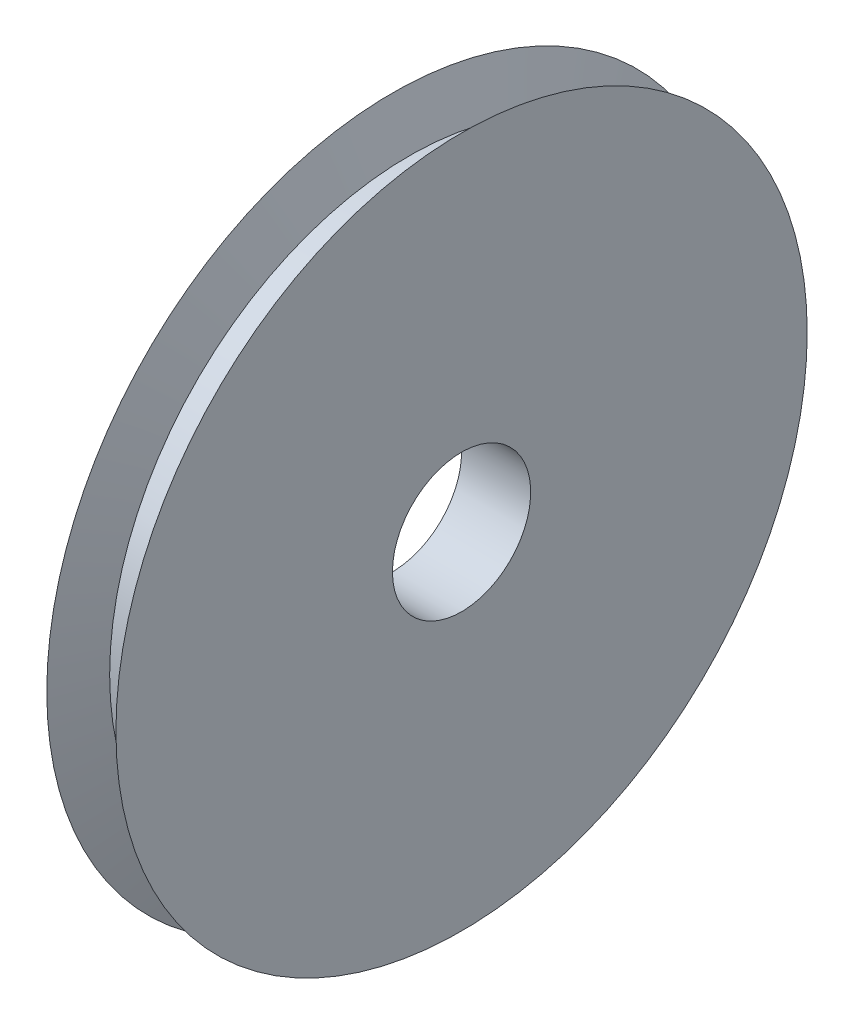
ISO-10303-21;
HEADER;
FILE_DESCRIPTION(('STEP AP214'),'2;1');
FILE_NAME('part.step','',(''),(''),'','','');
FILE_SCHEMA(('AUTOMOTIVE_DESIGN { 1 0 10303 214 1 1 1 1 }'));
ENDSEC;
DATA;
#1=APPLICATION_CONTEXT('core data for automotive mechanical design processes');
#2=APPLICATION_PROTOCOL_DEFINITION('international standard','automotive_design',2000,#1);
#3=PRODUCT_CONTEXT('',#1,'mechanical');
#4=PRODUCT('Part','Part','',(#3));
#5=PRODUCT_RELATED_PRODUCT_CATEGORY('part','',(#4));
#6=PRODUCT_DEFINITION_FORMATION('','',#4);
#7=PRODUCT_DEFINITION_CONTEXT('part definition',#1,'design');
#8=PRODUCT_DEFINITION('design','',#6,#7);
#9=PRODUCT_DEFINITION_SHAPE('','',#8);
#10=(LENGTH_UNIT() NAMED_UNIT(*) SI_UNIT(.MILLI.,.METRE.));
#11=(NAMED_UNIT(*) PLANE_ANGLE_UNIT() SI_UNIT($,.RADIAN.));
#12=(NAMED_UNIT(*) SI_UNIT($,.STERADIAN.) SOLID_ANGLE_UNIT());
#13=UNCERTAINTY_MEASURE_WITH_UNIT(LENGTH_MEASURE(1.E-05),#10,'distance_accuracy_value','');
#14=(GEOMETRIC_REPRESENTATION_CONTEXT(3) GLOBAL_UNCERTAINTY_ASSIGNED_CONTEXT((#13)) GLOBAL_UNIT_ASSIGNED_CONTEXT((#10,
#11,#12)) REPRESENTATION_CONTEXT('',''));
#15=CARTESIAN_POINT('',(0.,0.,0.));
#16=DIRECTION('',(0.,0.,1.));
#17=DIRECTION('',(1.,0.,0.));
#18=AXIS2_PLACEMENT_3D('',#15,#16,#17);
#19=CARTESIAN_POINT('',(7.5,15.,0.));
#20=DIRECTION('',(-1.,0.,0.));
#21=DIRECTION('',(0.,0.,1.));
#22=AXIS2_PLACEMENT_3D('',#19,#20,#21);
#23=PLANE('',#22);
#24=CARTESIAN_POINT('',(7.5,0.,0.));
#25=DIRECTION('',(-1.,0.,0.));
#26=DIRECTION('',(0.,0.,1.));
#27=AXIS2_PLACEMENT_3D('',#24,#25,#26);
#28=CIRCLE('',#27,75.);
#29=CARTESIAN_POINT('',(7.5,0.,75.));
#30=VERTEX_POINT('',#29);
#31=EDGE_CURVE('E70',#30,#30,#28,.T.);
#32=ORIENTED_EDGE('',*,*,#31,.F.);
#33=EDGE_LOOP('',(#32));
#34=FACE_BOUND('',#33,.T.);
#35=CARTESIAN_POINT('',(7.5,0.,0.));
#36=DIRECTION('',(-1.,0.,0.));
#37=DIRECTION('',(0.,0.,1.));
#38=AXIS2_PLACEMENT_3D('',#35,#36,#37);
#39=CIRCLE('',#38,15.);
#40=CARTESIAN_POINT('',(7.5,0.,15.));
#41=VERTEX_POINT('',#40);
#42=EDGE_CURVE('E10',#41,#41,#39,.T.);
#43=ORIENTED_EDGE('',*,*,#42,.T.);
#44=EDGE_LOOP('',(#43));
#45=FACE_BOUND('',#44,.T.);
#46=ADVANCED_FACE('F43',(#34,#45),#23,.F.);
#47=CARTESIAN_POINT('',(-41.4612856147118,0.,0.));
#48=DIRECTION('',(-1.,0.,0.));
#49=DIRECTION('',(0.,0.,1.));
#50=AXIS2_PLACEMENT_3D('',#47,#48,#49);
#51=CYLINDRICAL_SURFACE('',#50,15.);
#52=ORIENTED_EDGE('',*,*,#42,.F.);
#53=EDGE_LOOP('',(#52));
#54=FACE_BOUND('',#53,.T.);
#55=CARTESIAN_POINT('',(-7.5,0.,0.));
#56=DIRECTION('',(-1.,0.,0.));
#57=DIRECTION('',(0.,0.,1.));
#58=AXIS2_PLACEMENT_3D('',#55,#56,#57);
#59=CIRCLE('',#58,15.);
#60=CARTESIAN_POINT('',(-7.5,0.,15.));
#61=VERTEX_POINT('',#60);
#62=EDGE_CURVE('E50',#61,#61,#59,.T.);
#63=ORIENTED_EDGE('',*,*,#62,.T.);
#64=EDGE_LOOP('',(#63));
#65=FACE_BOUND('',#64,.T.);
#66=ADVANCED_FACE('F78',(#54,#65),#51,.F.);
#67=CARTESIAN_POINT('',(-7.5,15.,0.));
#68=DIRECTION('',(1.,0.,0.));
#69=DIRECTION('',(0.,0.,-1.));
#70=AXIS2_PLACEMENT_3D('',#67,#68,#69);
#71=PLANE('',#70);
#72=ORIENTED_EDGE('',*,*,#62,.F.);
#73=EDGE_LOOP('',(#72));
#74=FACE_BOUND('',#73,.T.);
#75=CARTESIAN_POINT('',(-7.5,0.,0.));
#76=DIRECTION('',(-1.,0.,0.));
#77=DIRECTION('',(0.,0.,1.));
#78=AXIS2_PLACEMENT_3D('',#75,#76,#77);
#79=CIRCLE('',#78,75.);
#80=CARTESIAN_POINT('',(-7.5,0.,75.));
#81=VERTEX_POINT('',#80);
#82=EDGE_CURVE('E55',#81,#81,#79,.T.);
#83=ORIENTED_EDGE('',*,*,#82,.T.);
#84=EDGE_LOOP('',(#83));
#85=FACE_BOUND('',#84,.T.);
#86=ADVANCED_FACE('F82',(#74,#85),#71,.F.);
#87=CARTESIAN_POINT('',(-3.86029765733796,0.,0.));
#88=DIRECTION('',(-1.,0.,0.));
#89=DIRECTION('',(0.,0.,1.));
#90=AXIS2_PLACEMENT_3D('',#87,#88,#89);
#91=CONICAL_SURFACE('',#90,65.,1.22173047639603);
#92=ORIENTED_EDGE('',*,*,#82,.F.);
#93=EDGE_LOOP('',(#92));
#94=FACE_BOUND('',#93,.T.);
#95=CARTESIAN_POINT('',(-3.86029765733796,0.,0.));
#96=DIRECTION('',(-1.,0.,0.));
#97=DIRECTION('',(0.,0.,1.));
#98=AXIS2_PLACEMENT_3D('',#95,#96,#97);
#99=CIRCLE('',#98,65.);
#100=CARTESIAN_POINT('',(-3.86029765733796,0.,65.));
#101=VERTEX_POINT('',#100);
#102=EDGE_CURVE('E60',#101,#101,#99,.T.);
#103=ORIENTED_EDGE('',*,*,#102,.T.);
#104=EDGE_LOOP('',(#103));
#105=FACE_BOUND('',#104,.T.);
#106=ADVANCED_FACE('F87',(#94,#105),#91,.T.);
#107=CARTESIAN_POINT('',(-41.4612856147118,0.,0.));
#108=DIRECTION('',(-1.,0.,0.));
#109=DIRECTION('',(0.,0.,1.));
#110=AXIS2_PLACEMENT_3D('',#107,#108,#109);
#111=CYLINDRICAL_SURFACE('',#110,65.);
#112=ORIENTED_EDGE('',*,*,#102,.F.);
#113=EDGE_LOOP('',(#112));
#114=FACE_BOUND('',#113,.T.);
#115=CARTESIAN_POINT('',(3.86029765733796,0.,0.));
#116=DIRECTION('',(-1.,0.,0.));
#117=DIRECTION('',(0.,0.,1.));
#118=AXIS2_PLACEMENT_3D('',#115,#116,#117);
#119=CIRCLE('',#118,65.);
#120=CARTESIAN_POINT('',(3.86029765733796,0.,65.));
#121=VERTEX_POINT('',#120);
#122=EDGE_CURVE('E66',#121,#121,#119,.T.);
#123=ORIENTED_EDGE('',*,*,#122,.T.);
#124=EDGE_LOOP('',(#123));
#125=FACE_BOUND('',#124,.T.);
#126=ADVANCED_FACE('F93',(#114,#125),#111,.T.);
#127=CARTESIAN_POINT('',(7.5,0.,0.));
#128=DIRECTION('',(1.,0.,0.));
#129=DIRECTION('',(0.,0.,-1.));
#130=AXIS2_PLACEMENT_3D('',#127,#128,#129);
#131=CONICAL_SURFACE('',#130,75.,1.22173047639603);
#132=ORIENTED_EDGE('',*,*,#122,.F.);
#133=EDGE_LOOP('',(#132));
#134=FACE_BOUND('',#133,.T.);
#135=ORIENTED_EDGE('',*,*,#31,.T.);
#136=EDGE_LOOP('',(#135));
#137=FACE_BOUND('',#136,.T.);
#138=ADVANCED_FACE('F75',(#134,#137),#131,.T.);
#139=CLOSED_SHELL('',(#46,#66,#86,#106,#126,#138));
#140=MANIFOLD_SOLID_BREP('B2',#139);
#141=ADVANCED_BREP_SHAPE_REPRESENTATION('',(#18,#140),#14);
#142=SHAPE_DEFINITION_REPRESENTATION(#9,#141);
ENDSEC;
END-ISO-10303-21;
